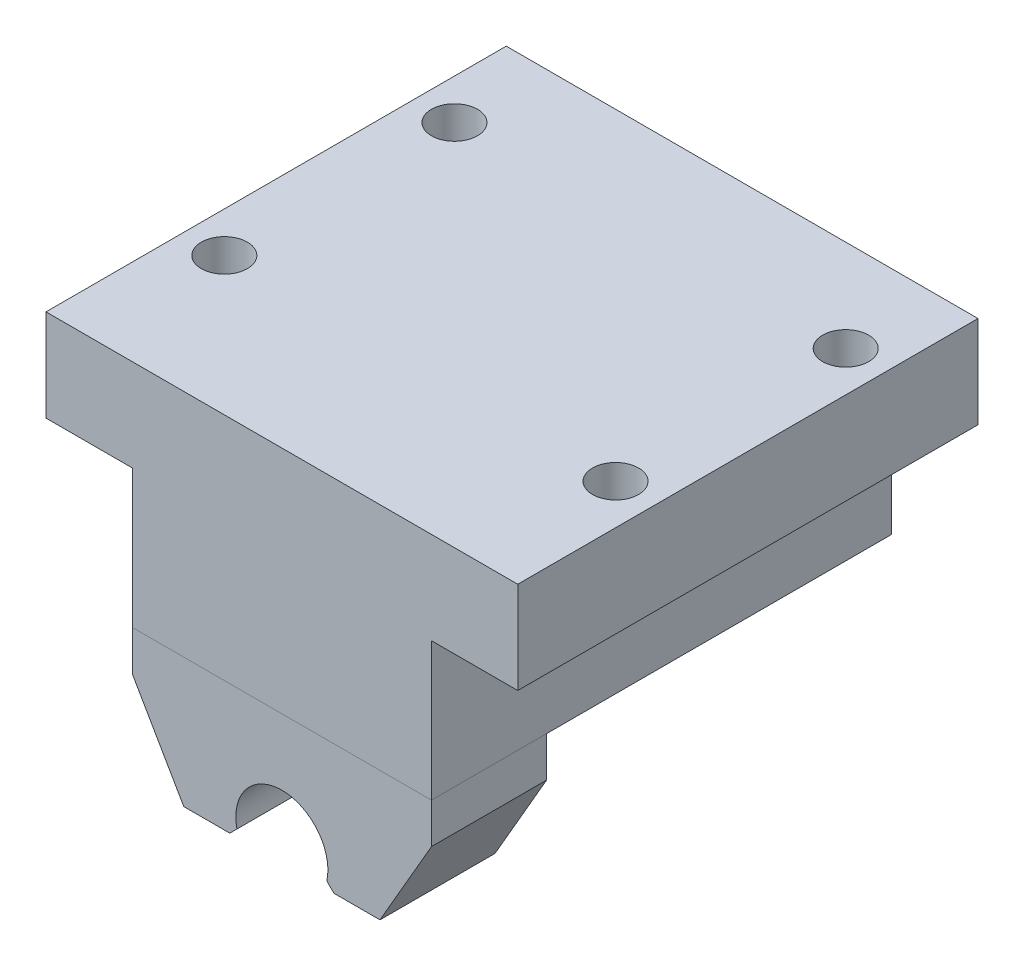
ISO-10303-21;
HEADER;
FILE_DESCRIPTION(('STEP AP214'),'2;1');
FILE_NAME('part.step','',(''),(''),'','','');
FILE_SCHEMA(('AUTOMOTIVE_DESIGN { 1 0 10303 214 1 1 1 1 }'));
ENDSEC;
DATA;
#1=APPLICATION_CONTEXT('core data for automotive mechanical design processes');
#2=APPLICATION_PROTOCOL_DEFINITION('international standard','automotive_design',2000,#1);
#3=PRODUCT_CONTEXT('',#1,'mechanical');
#4=PRODUCT('Part','Part','',(#3));
#5=PRODUCT_RELATED_PRODUCT_CATEGORY('part','',(#4));
#6=PRODUCT_DEFINITION_FORMATION('','',#4);
#7=PRODUCT_DEFINITION_CONTEXT('part definition',#1,'design');
#8=PRODUCT_DEFINITION('design','',#6,#7);
#9=PRODUCT_DEFINITION_SHAPE('','',#8);
#10=(LENGTH_UNIT() NAMED_UNIT(*) SI_UNIT(.MILLI.,.METRE.));
#11=(NAMED_UNIT(*) PLANE_ANGLE_UNIT() SI_UNIT($,.RADIAN.));
#12=(NAMED_UNIT(*) SI_UNIT($,.STERADIAN.) SOLID_ANGLE_UNIT());
#13=UNCERTAINTY_MEASURE_WITH_UNIT(LENGTH_MEASURE(1.E-05),#10,'distance_accuracy_value','');
#14=(GEOMETRIC_REPRESENTATION_CONTEXT(3) GLOBAL_UNCERTAINTY_ASSIGNED_CONTEXT((#13)) GLOBAL_UNIT_ASSIGNED_CONTEXT((#10,
#11,#12)) REPRESENTATION_CONTEXT('',''));
#15=CARTESIAN_POINT('',(0.,0.,0.));
#16=DIRECTION('',(0.,0.,1.));
#17=DIRECTION('',(1.,0.,0.));
#18=AXIS2_PLACEMENT_3D('',#15,#16,#17);
#19=CARTESIAN_POINT('',(13.,-16.,10.));
#20=DIRECTION('',(1.,0.,0.));
#21=DIRECTION('',(0.,0.,-1.));
#22=AXIS2_PLACEMENT_3D('',#19,#20,#21);
#23=PLANE('',#22);
#24=DIRECTION('',(0.,1.,0.));
#25=VECTOR('',#24,1.);
#26=CARTESIAN_POINT('',(13.,-16.,20.));
#27=LINE('',#26,#25);
#28=CARTESIAN_POINT('',(13.,-19.5,20.));
#29=VERTEX_POINT('',#28);
#30=CARTESIAN_POINT('',(13.,-16.,20.));
#31=VERTEX_POINT('',#30);
#32=EDGE_CURVE('E152',#29,#31,#27,.T.);
#33=ORIENTED_EDGE('',*,*,#32,.F.);
#34=DIRECTION('',(0.,0.,1.));
#35=VECTOR('',#34,1.);
#36=CARTESIAN_POINT('',(13.,-19.5,10.));
#37=LINE('',#36,#35);
#38=CARTESIAN_POINT('',(13.,-19.5,10.));
#39=VERTEX_POINT('',#38);
#40=EDGE_CURVE('E12',#39,#29,#37,.T.);
#41=ORIENTED_EDGE('',*,*,#40,.F.);
#42=DIRECTION('',(0.,1.,0.));
#43=VECTOR('',#42,1.);
#44=CARTESIAN_POINT('',(13.,-16.,10.));
#45=LINE('',#44,#43);
#46=CARTESIAN_POINT('',(13.,-16.,10.));
#47=VERTEX_POINT('',#46);
#48=EDGE_CURVE('E178',#39,#47,#45,.T.);
#49=ORIENTED_EDGE('',*,*,#48,.T.);
#50=DIRECTION('',(0.,0.,1.));
#51=VECTOR('',#50,1.);
#52=CARTESIAN_POINT('',(13.,-16.,10.));
#53=LINE('',#52,#51);
#54=EDGE_CURVE('E46',#47,#31,#53,.T.);
#55=ORIENTED_EDGE('',*,*,#54,.T.);
#56=EDGE_LOOP('',(#33,#41,#49,#55));
#57=FACE_BOUND('',#56,.T.);
#58=ADVANCED_FACE('F43',(#57),#23,.T.);
#59=CARTESIAN_POINT('',(13.,-19.5,10.));
#60=DIRECTION('',(0.866025403784438,-0.500000000000001,0.));
#61=DIRECTION('',(0.500000000000001,0.866025403784438,0.));
#62=AXIS2_PLACEMENT_3D('',#59,#60,#61);
#63=PLANE('',#62);
#64=DIRECTION('',(0.500000000000001,0.866025403784438,0.));
#65=VECTOR('',#64,1.);
#66=CARTESIAN_POINT('',(13.,-19.5,20.));
#67=LINE('',#66,#65);
#68=CARTESIAN_POINT('',(8.52553541378038,-27.25,20.));
#69=VERTEX_POINT('',#68);
#70=EDGE_CURVE('E176',#69,#29,#67,.T.);
#71=ORIENTED_EDGE('',*,*,#70,.F.);
#72=DIRECTION('',(0.,0.,1.));
#73=VECTOR('',#72,1.);
#74=CARTESIAN_POINT('',(8.52553541378038,-27.25,10.));
#75=LINE('',#74,#73);
#76=CARTESIAN_POINT('',(8.52553541378038,-27.25,10.));
#77=VERTEX_POINT('',#76);
#78=EDGE_CURVE('E52',#77,#69,#75,.T.);
#79=ORIENTED_EDGE('',*,*,#78,.F.);
#80=DIRECTION('',(0.500000000000001,0.866025403784438,0.));
#81=VECTOR('',#80,1.);
#82=CARTESIAN_POINT('',(13.,-19.5,10.));
#83=LINE('',#82,#81);
#84=EDGE_CURVE('E142',#77,#39,#83,.T.);
#85=ORIENTED_EDGE('',*,*,#84,.T.);
#86=ORIENTED_EDGE('',*,*,#40,.T.);
#87=EDGE_LOOP('',(#71,#79,#85,#86));
#88=FACE_BOUND('',#87,.T.);
#89=ADVANCED_FACE('F194',(#88),#63,.T.);
#90=CARTESIAN_POINT('',(8.52553541378038,-27.25,10.));
#91=DIRECTION('',(0.,-1.,0.));
#92=DIRECTION('',(0.,0.,-1.));
#93=AXIS2_PLACEMENT_3D('',#90,#91,#92);
#94=PLANE('',#93);
#95=DIRECTION('',(1.,0.,0.));
#96=VECTOR('',#95,1.);
#97=CARTESIAN_POINT('',(8.52553541378038,-27.25,20.));
#98=LINE('',#97,#96);
#99=CARTESIAN_POINT('',(4.52553541378038,-27.25,20.));
#100=VERTEX_POINT('',#99);
#101=EDGE_CURVE('E129',#100,#69,#98,.T.);
#102=ORIENTED_EDGE('',*,*,#101,.F.);
#103=DIRECTION('',(0.,0.,1.));
#104=VECTOR('',#103,1.);
#105=CARTESIAN_POINT('',(4.52553541378038,-27.25,10.));
#106=LINE('',#105,#104);
#107=CARTESIAN_POINT('',(4.52553541378038,-27.25,10.));
#108=VERTEX_POINT('',#107);
#109=EDGE_CURVE('E124',#108,#100,#106,.T.);
#110=ORIENTED_EDGE('',*,*,#109,.F.);
#111=DIRECTION('',(1.,0.,0.));
#112=VECTOR('',#111,1.);
#113=CARTESIAN_POINT('',(8.52553541378038,-27.25,10.));
#114=LINE('',#113,#112);
#115=EDGE_CURVE('E127',#108,#77,#114,.T.);
#116=ORIENTED_EDGE('',*,*,#115,.T.);
#117=ORIENTED_EDGE('',*,*,#78,.T.);
#118=EDGE_LOOP('',(#102,#110,#116,#117));
#119=FACE_BOUND('',#118,.T.);
#120=ADVANCED_FACE('F126',(#119),#94,.T.);
#121=CARTESIAN_POINT('',(4.52553541378038,-27.25,10.));
#122=DIRECTION('',(-0.707106781186548,-0.707106781186547,0.));
#123=DIRECTION('',(0.707106781186547,-0.707106781186548,0.));
#124=AXIS2_PLACEMENT_3D('',#121,#122,#123);
#125=PLANE('',#124);
#126=DIRECTION('',(0.707106781186547,-0.707106781186548,0.));
#127=VECTOR('',#126,1.);
#128=CARTESIAN_POINT('',(4.52553541378038,-27.25,20.));
#129=LINE('',#128,#127);
#130=CARTESIAN_POINT('',(3.90264926566882,-26.6271138518884,20.));
#131=VERTEX_POINT('',#130);
#132=EDGE_CURVE('E173',#131,#100,#129,.T.);
#133=ORIENTED_EDGE('',*,*,#132,.F.);
#134=DIRECTION('',(0.,0.,1.));
#135=VECTOR('',#134,1.);
#136=CARTESIAN_POINT('',(3.90264926566882,-26.6271138518884,10.));
#137=LINE('',#136,#135);
#138=CARTESIAN_POINT('',(3.90264926566882,-26.6271138518884,10.));
#139=VERTEX_POINT('',#138);
#140=EDGE_CURVE('E134',#139,#131,#137,.T.);
#141=ORIENTED_EDGE('',*,*,#140,.F.);
#142=DIRECTION('',(0.707106781186547,-0.707106781186548,0.));
#143=VECTOR('',#142,1.);
#144=CARTESIAN_POINT('',(4.52553541378038,-27.25,10.));
#145=LINE('',#144,#143);
#146=EDGE_CURVE('E140',#139,#108,#145,.T.);
#147=ORIENTED_EDGE('',*,*,#146,.T.);
#148=ORIENTED_EDGE('',*,*,#109,.T.);
#149=EDGE_LOOP('',(#133,#141,#147,#148));
#150=FACE_BOUND('',#149,.T.);
#151=ADVANCED_FACE('F144',(#150),#125,.T.);
#152=CARTESIAN_POINT('',(0.,-25.75,10.));
#153=DIRECTION('',(0.,0.,1.));
#154=DIRECTION('',(1.,0.,0.));
#155=AXIS2_PLACEMENT_3D('',#152,#153,#154);
#156=CYLINDRICAL_SURFACE('',#155,4.);
#157=CARTESIAN_POINT('',(0.,-25.75,20.));
#158=DIRECTION('',(0.,0.,-1.));
#159=DIRECTION('',(1.,0.,0.));
#160=AXIS2_PLACEMENT_3D('',#157,#158,#159);
#161=CIRCLE('',#160,4.);
#162=CARTESIAN_POINT('',(-3.90264926566883,-26.6271138518884,20.));
#163=VERTEX_POINT('',#162);
#164=EDGE_CURVE('E170',#163,#131,#161,.T.);
#165=ORIENTED_EDGE('',*,*,#164,.F.);
#166=DIRECTION('',(0.,0.,1.));
#167=VECTOR('',#166,1.);
#168=CARTESIAN_POINT('',(-3.90264926566883,-26.6271138518884,10.));
#169=LINE('',#168,#167);
#170=CARTESIAN_POINT('',(-3.90264926566883,-26.6271138518884,10.));
#171=VERTEX_POINT('',#170);
#172=EDGE_CURVE('E182',#171,#163,#169,.T.);
#173=ORIENTED_EDGE('',*,*,#172,.F.);
#174=CARTESIAN_POINT('',(0.,-25.75,10.));
#175=DIRECTION('',(0.,0.,-1.));
#176=DIRECTION('',(1.,0.,0.));
#177=AXIS2_PLACEMENT_3D('',#174,#175,#176);
#178=CIRCLE('',#177,4.);
#179=EDGE_CURVE('E145',#171,#139,#178,.T.);
#180=ORIENTED_EDGE('',*,*,#179,.T.);
#181=ORIENTED_EDGE('',*,*,#140,.T.);
#182=EDGE_LOOP('',(#165,#173,#180,#181));
#183=FACE_BOUND('',#182,.T.);
#184=ADVANCED_FACE('F207',(#183),#156,.F.);
#185=CARTESIAN_POINT('',(-4.52553541378039,-27.25,10.));
#186=DIRECTION('',(0.707106781186553,-0.707106781186542,0.));
#187=DIRECTION('',(0.707106781186542,0.707106781186553,0.));
#188=AXIS2_PLACEMENT_3D('',#185,#186,#187);
#189=PLANE('',#188);
#190=DIRECTION('',(0.707106781186542,0.707106781186553,0.));
#191=VECTOR('',#190,1.);
#192=CARTESIAN_POINT('',(-4.52553541378039,-27.25,20.));
#193=LINE('',#192,#191);
#194=CARTESIAN_POINT('',(-4.52553541378039,-27.25,20.));
#195=VERTEX_POINT('',#194);
#196=EDGE_CURVE('E167',#195,#163,#193,.T.);
#197=ORIENTED_EDGE('',*,*,#196,.F.);
#198=DIRECTION('',(0.,0.,1.));
#199=VECTOR('',#198,1.);
#200=CARTESIAN_POINT('',(-4.52553541378039,-27.25,10.));
#201=LINE('',#200,#199);
#202=CARTESIAN_POINT('',(-4.52553541378039,-27.25,10.));
#203=VERTEX_POINT('',#202);
#204=EDGE_CURVE('E184',#203,#195,#201,.T.);
#205=ORIENTED_EDGE('',*,*,#204,.F.);
#206=DIRECTION('',(0.707106781186542,0.707106781186553,0.));
#207=VECTOR('',#206,1.);
#208=CARTESIAN_POINT('',(-4.52553541378039,-27.25,10.));
#209=LINE('',#208,#207);
#210=EDGE_CURVE('E147',#203,#171,#209,.T.);
#211=ORIENTED_EDGE('',*,*,#210,.T.);
#212=ORIENTED_EDGE('',*,*,#172,.T.);
#213=EDGE_LOOP('',(#197,#205,#211,#212));
#214=FACE_BOUND('',#213,.T.);
#215=ADVANCED_FACE('F210',(#214),#189,.T.);
#216=CARTESIAN_POINT('',(-8.52553541378039,-27.25,10.));
#217=DIRECTION('',(0.,-1.,0.));
#218=DIRECTION('',(1.,0.,0.));
#219=AXIS2_PLACEMENT_3D('',#216,#217,#218);
#220=PLANE('',#219);
#221=DIRECTION('',(1.,0.,0.));
#222=VECTOR('',#221,1.);
#223=CARTESIAN_POINT('',(-8.52553541378039,-27.25,20.));
#224=LINE('',#223,#222);
#225=CARTESIAN_POINT('',(-8.52553541378039,-27.25,20.));
#226=VERTEX_POINT('',#225);
#227=EDGE_CURVE('E164',#226,#195,#224,.T.);
#228=ORIENTED_EDGE('',*,*,#227,.F.);
#229=DIRECTION('',(0.,0.,1.));
#230=VECTOR('',#229,1.);
#231=CARTESIAN_POINT('',(-8.52553541378039,-27.25,10.));
#232=LINE('',#231,#230);
#233=CARTESIAN_POINT('',(-8.52553541378039,-27.25,10.));
#234=VERTEX_POINT('',#233);
#235=EDGE_CURVE('E186',#234,#226,#232,.T.);
#236=ORIENTED_EDGE('',*,*,#235,.F.);
#237=DIRECTION('',(1.,0.,0.));
#238=VECTOR('',#237,1.);
#239=CARTESIAN_POINT('',(-8.52553541378039,-27.25,10.));
#240=LINE('',#239,#238);
#241=EDGE_CURVE('E309',#234,#203,#240,.T.);
#242=ORIENTED_EDGE('',*,*,#241,.T.);
#243=ORIENTED_EDGE('',*,*,#204,.T.);
#244=EDGE_LOOP('',(#228,#236,#242,#243));
#245=FACE_BOUND('',#244,.T.);
#246=ADVANCED_FACE('F214',(#245),#220,.T.);
#247=CARTESIAN_POINT('',(-13.,-19.5,10.));
#248=DIRECTION('',(-0.866025403784438,-0.500000000000001,0.));
#249=DIRECTION('',(0.500000000000001,-0.866025403784438,0.));
#250=AXIS2_PLACEMENT_3D('',#247,#248,#249);
#251=PLANE('',#250);
#252=DIRECTION('',(0.500000000000001,-0.866025403784438,0.));
#253=VECTOR('',#252,1.);
#254=CARTESIAN_POINT('',(-13.,-19.5,20.));
#255=LINE('',#254,#253);
#256=CARTESIAN_POINT('',(-13.,-19.5,20.));
#257=VERTEX_POINT('',#256);
#258=EDGE_CURVE('E161',#257,#226,#255,.T.);
#259=ORIENTED_EDGE('',*,*,#258,.F.);
#260=DIRECTION('',(0.,0.,1.));
#261=VECTOR('',#260,1.);
#262=CARTESIAN_POINT('',(-13.,-19.5,10.));
#263=LINE('',#262,#261);
#264=CARTESIAN_POINT('',(-13.,-19.5,10.));
#265=VERTEX_POINT('',#264);
#266=EDGE_CURVE('E188',#265,#257,#263,.T.);
#267=ORIENTED_EDGE('',*,*,#266,.F.);
#268=DIRECTION('',(0.500000000000001,-0.866025403784438,0.));
#269=VECTOR('',#268,1.);
#270=CARTESIAN_POINT('',(-13.,-19.5,10.));
#271=LINE('',#270,#269);
#272=EDGE_CURVE('E305',#265,#234,#271,.T.);
#273=ORIENTED_EDGE('',*,*,#272,.T.);
#274=ORIENTED_EDGE('',*,*,#235,.T.);
#275=EDGE_LOOP('',(#259,#267,#273,#274));
#276=FACE_BOUND('',#275,.T.);
#277=ADVANCED_FACE('F218',(#276),#251,.T.);
#278=CARTESIAN_POINT('',(-13.,-16.,10.));
#279=DIRECTION('',(-1.,0.,0.));
#280=DIRECTION('',(0.,0.,1.));
#281=AXIS2_PLACEMENT_3D('',#278,#279,#280);
#282=PLANE('',#281);
#283=DIRECTION('',(0.,-1.,0.));
#284=VECTOR('',#283,1.);
#285=CARTESIAN_POINT('',(-13.,-16.,20.));
#286=LINE('',#285,#284);
#287=CARTESIAN_POINT('',(-13.,-16.,20.));
#288=VERTEX_POINT('',#287);
#289=EDGE_CURVE('E158',#288,#257,#286,.T.);
#290=ORIENTED_EDGE('',*,*,#289,.F.);
#291=DIRECTION('',(0.,0.,1.));
#292=VECTOR('',#291,1.);
#293=CARTESIAN_POINT('',(-13.,-16.,10.));
#294=LINE('',#293,#292);
#295=CARTESIAN_POINT('',(-13.,-16.,10.));
#296=VERTEX_POINT('',#295);
#297=EDGE_CURVE('E189',#296,#288,#294,.T.);
#298=ORIENTED_EDGE('',*,*,#297,.F.);
#299=DIRECTION('',(0.,-1.,0.));
#300=VECTOR('',#299,1.);
#301=CARTESIAN_POINT('',(-13.,-16.,10.));
#302=LINE('',#301,#300);
#303=EDGE_CURVE('E316',#296,#265,#302,.T.);
#304=ORIENTED_EDGE('',*,*,#303,.T.);
#305=ORIENTED_EDGE('',*,*,#266,.T.);
#306=EDGE_LOOP('',(#290,#298,#304,#305));
#307=FACE_BOUND('',#306,.T.);
#308=ADVANCED_FACE('F222',(#307),#282,.T.);
#309=CARTESIAN_POINT('',(13.,-16.,10.));
#310=DIRECTION('',(0.,1.,0.));
#311=DIRECTION('',(0.,0.,1.));
#312=AXIS2_PLACEMENT_3D('',#309,#310,#311);
#313=PLANE('',#312);
#314=DIRECTION('',(-1.,0.,0.));
#315=VECTOR('',#314,1.);
#316=CARTESIAN_POINT('',(13.,-16.,20.));
#317=LINE('',#316,#315);
#318=EDGE_CURVE('E155',#31,#288,#317,.T.);
#319=ORIENTED_EDGE('',*,*,#318,.F.);
#320=ORIENTED_EDGE('',*,*,#54,.F.);
#321=DIRECTION('',(-1.,0.,0.));
#322=VECTOR('',#321,1.);
#323=CARTESIAN_POINT('',(13.,-16.,10.));
#324=LINE('',#323,#322);
#325=EDGE_CURVE('E318',#47,#296,#324,.T.);
#326=ORIENTED_EDGE('',*,*,#325,.T.);
#327=ORIENTED_EDGE('',*,*,#297,.T.);
#328=EDGE_LOOP('',(#319,#320,#326,#327));
#329=FACE_BOUND('',#328,.T.);
#330=ADVANCED_FACE('F191',(#329),#313,.T.);
#331=CARTESIAN_POINT('',(0.,-25.75,10.));
#332=DIRECTION('',(0.,0.,1.));
#333=DIRECTION('',(1.,0.,0.));
#334=AXIS2_PLACEMENT_3D('',#331,#332,#333);
#335=PLANE('',#334);
#336=ORIENTED_EDGE('',*,*,#48,.F.);
#337=ORIENTED_EDGE('',*,*,#84,.F.);
#338=ORIENTED_EDGE('',*,*,#115,.F.);
#339=ORIENTED_EDGE('',*,*,#146,.F.);
#340=ORIENTED_EDGE('',*,*,#179,.F.);
#341=ORIENTED_EDGE('',*,*,#210,.F.);
#342=ORIENTED_EDGE('',*,*,#241,.F.);
#343=ORIENTED_EDGE('',*,*,#272,.F.);
#344=ORIENTED_EDGE('',*,*,#303,.F.);
#345=ORIENTED_EDGE('',*,*,#325,.F.);
#346=EDGE_LOOP('',(#336,#337,#338,#339,#340,#341,#342,#343,#344,#345));
#347=FACE_BOUND('',#346,.T.);
#348=ADVANCED_FACE('F138',(#347),#335,.F.);
#349=CARTESIAN_POINT('',(0.,-25.75,20.));
#350=DIRECTION('',(0.,0.,1.));
#351=DIRECTION('',(1.,0.,0.));
#352=AXIS2_PLACEMENT_3D('',#349,#350,#351);
#353=PLANE('',#352);
#354=ORIENTED_EDGE('',*,*,#32,.T.);
#355=ORIENTED_EDGE('',*,*,#318,.T.);
#356=ORIENTED_EDGE('',*,*,#289,.T.);
#357=ORIENTED_EDGE('',*,*,#258,.T.);
#358=ORIENTED_EDGE('',*,*,#227,.T.);
#359=ORIENTED_EDGE('',*,*,#196,.T.);
#360=ORIENTED_EDGE('',*,*,#164,.T.);
#361=ORIENTED_EDGE('',*,*,#132,.T.);
#362=ORIENTED_EDGE('',*,*,#101,.T.);
#363=ORIENTED_EDGE('',*,*,#70,.T.);
#364=EDGE_LOOP('',(#354,#355,#356,#357,#358,#359,#360,#361,#362,#363));
#365=FACE_BOUND('',#364,.T.);
#366=ADVANCED_FACE('F193',(#365),#353,.T.);
#367=CLOSED_SHELL('',(#58,#89,#120,#151,#184,#215,#246,#277,#308,#330,#348,#366));
#368=MANIFOLD_SOLID_BREP('B2',#367);
#369=CARTESIAN_POINT('',(20.5,-4.,20.));
#370=DIRECTION('',(-1.,0.,0.));
#371=DIRECTION('',(0.,0.,1.));
#372=AXIS2_PLACEMENT_3D('',#369,#370,#371);
#373=PLANE('',#372);
#374=DIRECTION('',(0.,1.,0.));
#375=VECTOR('',#374,1.);
#376=CARTESIAN_POINT('',(20.5,-4.,-20.));
#377=LINE('',#376,#375);
#378=CARTESIAN_POINT('',(20.5,-4.,-20.));
#379=VERTEX_POINT('',#378);
#380=CARTESIAN_POINT('',(20.5,4.,-20.));
#381=VERTEX_POINT('',#380);
#382=EDGE_CURVE('E419',#379,#381,#377,.T.);
#383=ORIENTED_EDGE('',*,*,#382,.T.);
#384=DIRECTION('',(0.,0.,-1.));
#385=VECTOR('',#384,1.);
#386=CARTESIAN_POINT('',(20.5,4.,20.));
#387=LINE('',#386,#385);
#388=CARTESIAN_POINT('',(20.5,4.,20.));
#389=VERTEX_POINT('',#388);
#390=EDGE_CURVE('E41',#389,#381,#387,.T.);
#391=ORIENTED_EDGE('',*,*,#390,.F.);
#392=DIRECTION('',(0.,1.,0.));
#393=VECTOR('',#392,1.);
#394=CARTESIAN_POINT('',(20.5,-4.,20.));
#395=LINE('',#394,#393);
#396=CARTESIAN_POINT('',(20.5,-4.,20.));
#397=VERTEX_POINT('',#396);
#398=EDGE_CURVE('E434',#397,#389,#395,.T.);
#399=ORIENTED_EDGE('',*,*,#398,.F.);
#400=DIRECTION('',(0.,0.,-1.));
#401=VECTOR('',#400,1.);
#402=CARTESIAN_POINT('',(20.5,-4.,20.));
#403=LINE('',#402,#401);
#404=EDGE_CURVE('E415',#397,#379,#403,.T.);
#405=ORIENTED_EDGE('',*,*,#404,.T.);
#406=EDGE_LOOP('',(#383,#391,#399,#405));
#407=FACE_BOUND('',#406,.T.);
#408=ADVANCED_FACE('F323',(#407),#373,.F.);
#409=CARTESIAN_POINT('',(-20.5,4.,20.));
#410=DIRECTION('',(0.,-1.,0.));
#411=DIRECTION('',(0.,0.,-1.));
#412=AXIS2_PLACEMENT_3D('',#409,#410,#411);
#413=PLANE('',#412);
#414=CARTESIAN_POINT('',(-17.,4.,8.));
#415=DIRECTION('',(0.,-1.,0.));
#416=DIRECTION('',(0.,0.,-1.));
#417=AXIS2_PLACEMENT_3D('',#414,#415,#416);
#418=CIRCLE('',#417,2.);
#419=CARTESIAN_POINT('',(-17.,4.,6.));
#420=VERTEX_POINT('',#419);
#421=EDGE_CURVE('E423',#420,#420,#418,.T.);
#422=ORIENTED_EDGE('',*,*,#421,.T.);
#423=EDGE_LOOP('',(#422));
#424=FACE_BOUND('',#423,.T.);
#425=CARTESIAN_POINT('',(17.,4.,-12.));
#426=DIRECTION('',(0.,-1.,0.));
#427=DIRECTION('',(0.,0.,-1.));
#428=AXIS2_PLACEMENT_3D('',#425,#426,#427);
#429=CIRCLE('',#428,2.00000000000001);
#430=CARTESIAN_POINT('',(17.,4.,-14.));
#431=VERTEX_POINT('',#430);
#432=EDGE_CURVE('E472',#431,#431,#429,.T.);
#433=ORIENTED_EDGE('',*,*,#432,.T.);
#434=EDGE_LOOP('',(#433));
#435=FACE_BOUND('',#434,.T.);
#436=CARTESIAN_POINT('',(17.,4.,8.));
#437=DIRECTION('',(0.,-1.,0.));
#438=DIRECTION('',(0.,0.,-1.));
#439=AXIS2_PLACEMENT_3D('',#436,#437,#438);
#440=CIRCLE('',#439,2.);
#441=CARTESIAN_POINT('',(17.,4.,6.));
#442=VERTEX_POINT('',#441);
#443=EDGE_CURVE('E475',#442,#442,#440,.T.);
#444=ORIENTED_EDGE('',*,*,#443,.T.);
#445=EDGE_LOOP('',(#444));
#446=FACE_BOUND('',#445,.T.);
#447=CARTESIAN_POINT('',(-17.,4.,-12.));
#448=DIRECTION('',(0.,-1.,0.));
#449=DIRECTION('',(0.,0.,-1.));
#450=AXIS2_PLACEMENT_3D('',#447,#448,#449);
#451=CIRCLE('',#450,2.);
#452=CARTESIAN_POINT('',(-17.,4.,-14.));
#453=VERTEX_POINT('',#452);
#454=EDGE_CURVE('E469',#453,#453,#451,.T.);
#455=ORIENTED_EDGE('',*,*,#454,.T.);
#456=EDGE_LOOP('',(#455));
#457=FACE_BOUND('',#456,.T.);
#458=DIRECTION('',(-1.,0.,0.));
#459=VECTOR('',#458,1.);
#460=CARTESIAN_POINT('',(-20.5,4.,-20.));
#461=LINE('',#460,#459);
#462=CARTESIAN_POINT('',(-20.5,4.,-20.));
#463=VERTEX_POINT('',#462);
#464=EDGE_CURVE('E422',#381,#463,#461,.T.);
#465=ORIENTED_EDGE('',*,*,#464,.T.);
#466=DIRECTION('',(0.,0.,-1.));
#467=VECTOR('',#466,1.);
#468=CARTESIAN_POINT('',(-20.5,4.,20.));
#469=LINE('',#468,#467);
#470=CARTESIAN_POINT('',(-20.5,4.,20.));
#471=VERTEX_POINT('',#470);
#472=EDGE_CURVE('E331',#471,#463,#469,.T.);
#473=ORIENTED_EDGE('',*,*,#472,.F.);
#474=DIRECTION('',(-1.,0.,0.));
#475=VECTOR('',#474,1.);
#476=CARTESIAN_POINT('',(-20.5,4.,20.));
#477=LINE('',#476,#475);
#478=EDGE_CURVE('E382',#389,#471,#477,.T.);
#479=ORIENTED_EDGE('',*,*,#478,.F.);
#480=ORIENTED_EDGE('',*,*,#390,.T.);
#481=EDGE_LOOP('',(#465,#473,#479,#480));
#482=FACE_BOUND('',#481,.T.);
#483=ADVANCED_FACE('F516',(#424,#435,#446,#457,#482),#413,.F.);
#484=CARTESIAN_POINT('',(-20.5,-4.,20.));
#485=DIRECTION('',(1.,0.,0.));
#486=DIRECTION('',(0.,0.,-1.));
#487=AXIS2_PLACEMENT_3D('',#484,#485,#486);
#488=PLANE('',#487);
#489=DIRECTION('',(0.,-1.,0.));
#490=VECTOR('',#489,1.);
#491=CARTESIAN_POINT('',(-20.5,-4.,-20.));
#492=LINE('',#491,#490);
#493=CARTESIAN_POINT('',(-20.5,-4.,-20.));
#494=VERTEX_POINT('',#493);
#495=EDGE_CURVE('E425',#463,#494,#492,.T.);
#496=ORIENTED_EDGE('',*,*,#495,.T.);
#497=DIRECTION('',(0.,0.,-1.));
#498=VECTOR('',#497,1.);
#499=CARTESIAN_POINT('',(-20.5,-4.,20.));
#500=LINE('',#499,#498);
#501=CARTESIAN_POINT('',(-20.5,-4.,20.));
#502=VERTEX_POINT('',#501);
#503=EDGE_CURVE('E441',#502,#494,#500,.T.);
#504=ORIENTED_EDGE('',*,*,#503,.F.);
#505=DIRECTION('',(0.,-1.,0.));
#506=VECTOR('',#505,1.);
#507=CARTESIAN_POINT('',(-20.5,-4.,20.));
#508=LINE('',#507,#506);
#509=EDGE_CURVE('E449',#471,#502,#508,.T.);
#510=ORIENTED_EDGE('',*,*,#509,.F.);
#511=ORIENTED_EDGE('',*,*,#472,.T.);
#512=EDGE_LOOP('',(#496,#504,#510,#511));
#513=FACE_BOUND('',#512,.T.);
#514=ADVANCED_FACE('F447',(#513),#488,.F.);
#515=CARTESIAN_POINT('',(-20.5,-4.,20.));
#516=DIRECTION('',(0.,1.,0.));
#517=DIRECTION('',(0.,0.,1.));
#518=AXIS2_PLACEMENT_3D('',#515,#516,#517);
#519=PLANE('',#518);
#520=CARTESIAN_POINT('',(-17.,-4.,8.));
#521=DIRECTION('',(0.,-1.,0.));
#522=DIRECTION('',(0.,0.,-1.));
#523=AXIS2_PLACEMENT_3D('',#520,#521,#522);
#524=CIRCLE('',#523,2.);
#525=CARTESIAN_POINT('',(-17.,-4.,6.));
#526=VERTEX_POINT('',#525);
#527=EDGE_CURVE('E481',#526,#526,#524,.T.);
#528=ORIENTED_EDGE('',*,*,#527,.F.);
#529=EDGE_LOOP('',(#528));
#530=FACE_BOUND('',#529,.T.);
#531=CARTESIAN_POINT('',(-17.,-4.,-12.));
#532=DIRECTION('',(0.,-1.,0.));
#533=DIRECTION('',(0.,0.,-1.));
#534=AXIS2_PLACEMENT_3D('',#531,#532,#533);
#535=CIRCLE('',#534,2.);
#536=CARTESIAN_POINT('',(-17.,-4.,-14.));
#537=VERTEX_POINT('',#536);
#538=EDGE_CURVE('E478',#537,#537,#535,.T.);
#539=ORIENTED_EDGE('',*,*,#538,.F.);
#540=EDGE_LOOP('',(#539));
#541=FACE_BOUND('',#540,.T.);
#542=DIRECTION('',(1.,0.,0.));
#543=VECTOR('',#542,1.);
#544=CARTESIAN_POINT('',(-20.5,-4.,-20.));
#545=LINE('',#544,#543);
#546=CARTESIAN_POINT('',(-13.,-4.,-20.));
#547=VERTEX_POINT('',#546);
#548=EDGE_CURVE('E427',#494,#547,#545,.T.);
#549=ORIENTED_EDGE('',*,*,#548,.T.);
#550=DIRECTION('',(0.,0.,-1.));
#551=VECTOR('',#550,1.);
#552=CARTESIAN_POINT('',(-13.,-4.,20.));
#553=LINE('',#552,#551);
#554=CARTESIAN_POINT('',(-13.,-4.,20.));
#555=VERTEX_POINT('',#554);
#556=EDGE_CURVE('E438',#555,#547,#553,.T.);
#557=ORIENTED_EDGE('',*,*,#556,.F.);
#558=DIRECTION('',(1.,0.,0.));
#559=VECTOR('',#558,1.);
#560=CARTESIAN_POINT('',(-20.5,-4.,20.));
#561=LINE('',#560,#559);
#562=EDGE_CURVE('E461',#502,#555,#561,.T.);
#563=ORIENTED_EDGE('',*,*,#562,.F.);
#564=ORIENTED_EDGE('',*,*,#503,.T.);
#565=EDGE_LOOP('',(#549,#557,#563,#564));
#566=FACE_BOUND('',#565,.T.);
#567=ADVANCED_FACE('F457',(#530,#541,#566),#519,.F.);
#568=CARTESIAN_POINT('',(-13.,-4.,20.));
#569=DIRECTION('',(1.,0.,0.));
#570=DIRECTION('',(0.,1.,0.));
#571=AXIS2_PLACEMENT_3D('',#568,#569,#570);
#572=PLANE('',#571);
#573=DIRECTION('',(0.,-1.,0.));
#574=VECTOR('',#573,1.);
#575=CARTESIAN_POINT('',(-13.,-4.,-20.));
#576=LINE('',#575,#574);
#577=CARTESIAN_POINT('',(-13.,-16.,-20.));
#578=VERTEX_POINT('',#577);
#579=EDGE_CURVE('E429',#547,#578,#576,.T.);
#580=ORIENTED_EDGE('',*,*,#579,.T.);
#581=DIRECTION('',(0.,0.,-1.));
#582=VECTOR('',#581,1.);
#583=CARTESIAN_POINT('',(-13.,-16.,20.));
#584=LINE('',#583,#582);
#585=CARTESIAN_POINT('',(-13.,-16.,20.));
#586=VERTEX_POINT('',#585);
#587=EDGE_CURVE('E410',#586,#578,#584,.T.);
#588=ORIENTED_EDGE('',*,*,#587,.F.);
#589=DIRECTION('',(0.,-1.,0.));
#590=VECTOR('',#589,1.);
#591=CARTESIAN_POINT('',(-13.,-4.,20.));
#592=LINE('',#591,#590);
#593=EDGE_CURVE('E401',#555,#586,#592,.T.);
#594=ORIENTED_EDGE('',*,*,#593,.F.);
#595=ORIENTED_EDGE('',*,*,#556,.T.);
#596=EDGE_LOOP('',(#580,#588,#594,#595));
#597=FACE_BOUND('',#596,.T.);
#598=ADVANCED_FACE('F460',(#597),#572,.F.);
#599=CARTESIAN_POINT('',(-13.,-16.,20.));
#600=DIRECTION('',(0.,1.,0.));
#601=DIRECTION('',(0.,0.,1.));
#602=AXIS2_PLACEMENT_3D('',#599,#600,#601);
#603=PLANE('',#602);
#604=CARTESIAN_POINT('',(0.,-16.,-4.5));
#605=DIRECTION('',(0.,-1.,0.));
#606=DIRECTION('',(0.,0.,-1.));
#607=AXIS2_PLACEMENT_3D('',#604,#605,#606);
#608=CIRCLE('',#607,5.075);
#609=CARTESIAN_POINT('',(0.,-16.,-9.575));
#610=VERTEX_POINT('',#609);
#611=EDGE_CURVE('E491',#610,#610,#608,.T.);
#612=ORIENTED_EDGE('',*,*,#611,.F.);
#613=EDGE_LOOP('',(#612));
#614=FACE_BOUND('',#613,.T.);
#615=DIRECTION('',(1.,0.,0.));
#616=VECTOR('',#615,1.);
#617=CARTESIAN_POINT('',(-13.,-16.,-20.));
#618=LINE('',#617,#616);
#619=CARTESIAN_POINT('',(13.,-16.,-20.));
#620=VERTEX_POINT('',#619);
#621=EDGE_CURVE('E409',#578,#620,#618,.T.);
#622=ORIENTED_EDGE('',*,*,#621,.T.);
#623=DIRECTION('',(0.,0.,-1.));
#624=VECTOR('',#623,1.);
#625=CARTESIAN_POINT('',(13.,-16.,20.));
#626=LINE('',#625,#624);
#627=CARTESIAN_POINT('',(13.,-16.,20.));
#628=VERTEX_POINT('',#627);
#629=EDGE_CURVE('E406',#628,#620,#626,.T.);
#630=ORIENTED_EDGE('',*,*,#629,.F.);
#631=DIRECTION('',(1.,0.,0.));
#632=VECTOR('',#631,1.);
#633=CARTESIAN_POINT('',(-13.,-16.,20.));
#634=LINE('',#633,#632);
#635=EDGE_CURVE('E395',#586,#628,#634,.T.);
#636=ORIENTED_EDGE('',*,*,#635,.F.);
#637=ORIENTED_EDGE('',*,*,#587,.T.);
#638=EDGE_LOOP('',(#622,#630,#636,#637));
#639=FACE_BOUND('',#638,.T.);
#640=ADVANCED_FACE('F407',(#614,#639),#603,.F.);
#641=CARTESIAN_POINT('',(13.,-4.,20.));
#642=DIRECTION('',(-1.,0.,0.));
#643=DIRECTION('',(0.,-1.,0.));
#644=AXIS2_PLACEMENT_3D('',#641,#642,#643);
#645=PLANE('',#644);
#646=DIRECTION('',(0.,1.,0.));
#647=VECTOR('',#646,1.);
#648=CARTESIAN_POINT('',(13.,-4.,-20.));
#649=LINE('',#648,#647);
#650=CARTESIAN_POINT('',(13.,-4.,-20.));
#651=VERTEX_POINT('',#650);
#652=EDGE_CURVE('E368',#620,#651,#649,.T.);
#653=ORIENTED_EDGE('',*,*,#652,.T.);
#654=DIRECTION('',(0.,0.,-1.));
#655=VECTOR('',#654,1.);
#656=CARTESIAN_POINT('',(13.,-4.,20.));
#657=LINE('',#656,#655);
#658=CARTESIAN_POINT('',(13.,-4.,20.));
#659=VERTEX_POINT('',#658);
#660=EDGE_CURVE('E411',#659,#651,#657,.T.);
#661=ORIENTED_EDGE('',*,*,#660,.F.);
#662=DIRECTION('',(0.,1.,0.));
#663=VECTOR('',#662,1.);
#664=CARTESIAN_POINT('',(13.,-4.,20.));
#665=LINE('',#664,#663);
#666=EDGE_CURVE('E399',#628,#659,#665,.T.);
#667=ORIENTED_EDGE('',*,*,#666,.F.);
#668=ORIENTED_EDGE('',*,*,#629,.T.);
#669=EDGE_LOOP('',(#653,#661,#667,#668));
#670=FACE_BOUND('',#669,.T.);
#671=ADVANCED_FACE('F413',(#670),#645,.F.);
#672=CARTESIAN_POINT('',(13.,-4.,20.));
#673=DIRECTION('',(0.,1.,0.));
#674=DIRECTION('',(0.,0.,1.));
#675=AXIS2_PLACEMENT_3D('',#672,#673,#674);
#676=PLANE('',#675);
#677=CARTESIAN_POINT('',(17.,-4.,-12.));
#678=DIRECTION('',(0.,-1.,0.));
#679=DIRECTION('',(0.,0.,-1.));
#680=AXIS2_PLACEMENT_3D('',#677,#678,#679);
#681=CIRCLE('',#680,2.00000000000001);
#682=CARTESIAN_POINT('',(17.,-4.,-14.));
#683=VERTEX_POINT('',#682);
#684=EDGE_CURVE('E482',#683,#683,#681,.T.);
#685=ORIENTED_EDGE('',*,*,#684,.F.);
#686=EDGE_LOOP('',(#685));
#687=FACE_BOUND('',#686,.T.);
#688=CARTESIAN_POINT('',(17.,-4.,8.));
#689=DIRECTION('',(0.,-1.,0.));
#690=DIRECTION('',(0.,0.,-1.));
#691=AXIS2_PLACEMENT_3D('',#688,#689,#690);
#692=CIRCLE('',#691,2.);
#693=CARTESIAN_POINT('',(17.,-4.,6.));
#694=VERTEX_POINT('',#693);
#695=EDGE_CURVE('E485',#694,#694,#692,.T.);
#696=ORIENTED_EDGE('',*,*,#695,.F.);
#697=EDGE_LOOP('',(#696));
#698=FACE_BOUND('',#697,.T.);
#699=DIRECTION('',(1.,0.,0.));
#700=VECTOR('',#699,1.);
#701=CARTESIAN_POINT('',(13.,-4.,-20.));
#702=LINE('',#701,#700);
#703=EDGE_CURVE('E374',#651,#379,#702,.T.);
#704=ORIENTED_EDGE('',*,*,#703,.T.);
#705=ORIENTED_EDGE('',*,*,#404,.F.);
#706=DIRECTION('',(1.,0.,0.));
#707=VECTOR('',#706,1.);
#708=CARTESIAN_POINT('',(13.,-4.,20.));
#709=LINE('',#708,#707);
#710=EDGE_CURVE('E339',#659,#397,#709,.T.);
#711=ORIENTED_EDGE('',*,*,#710,.F.);
#712=ORIENTED_EDGE('',*,*,#660,.T.);
#713=EDGE_LOOP('',(#704,#705,#711,#712));
#714=FACE_BOUND('',#713,.T.);
#715=ADVANCED_FACE('F512',(#687,#698,#714),#676,.F.);
#716=CARTESIAN_POINT('',(0.,0.,20.));
#717=DIRECTION('',(0.,0.,-1.));
#718=DIRECTION('',(-1.,0.,0.));
#719=AXIS2_PLACEMENT_3D('',#716,#717,#718);
#720=PLANE('',#719);
#721=ORIENTED_EDGE('',*,*,#398,.T.);
#722=ORIENTED_EDGE('',*,*,#478,.T.);
#723=ORIENTED_EDGE('',*,*,#509,.T.);
#724=ORIENTED_EDGE('',*,*,#562,.T.);
#725=ORIENTED_EDGE('',*,*,#593,.T.);
#726=ORIENTED_EDGE('',*,*,#635,.T.);
#727=ORIENTED_EDGE('',*,*,#666,.T.);
#728=ORIENTED_EDGE('',*,*,#710,.T.);
#729=EDGE_LOOP('',(#721,#722,#723,#724,#725,#726,#727,#728));
#730=FACE_BOUND('',#729,.T.);
#731=ADVANCED_FACE('F397',(#730),#720,.F.);
#732=CARTESIAN_POINT('',(0.,0.,-20.));
#733=DIRECTION('',(0.,0.,-1.));
#734=DIRECTION('',(-1.,0.,0.));
#735=AXIS2_PLACEMENT_3D('',#732,#733,#734);
#736=PLANE('',#735);
#737=ORIENTED_EDGE('',*,*,#382,.F.);
#738=ORIENTED_EDGE('',*,*,#703,.F.);
#739=ORIENTED_EDGE('',*,*,#652,.F.);
#740=ORIENTED_EDGE('',*,*,#621,.F.);
#741=ORIENTED_EDGE('',*,*,#579,.F.);
#742=ORIENTED_EDGE('',*,*,#548,.F.);
#743=ORIENTED_EDGE('',*,*,#495,.F.);
#744=ORIENTED_EDGE('',*,*,#464,.F.);
#745=EDGE_LOOP('',(#737,#738,#739,#740,#741,#742,#743,#744));
#746=FACE_BOUND('',#745,.T.);
#747=ADVANCED_FACE('F453',(#746),#736,.T.);
#748=CARTESIAN_POINT('',(17.,6.,8.));
#749=DIRECTION('',(0.,-1.,0.));
#750=DIRECTION('',(0.,0.,-1.));
#751=AXIS2_PLACEMENT_3D('',#748,#749,#750);
#752=CYLINDRICAL_SURFACE('',#751,2.);
#753=ORIENTED_EDGE('',*,*,#695,.T.);
#754=EDGE_LOOP('',(#753));
#755=FACE_BOUND('',#754,.T.);
#756=ORIENTED_EDGE('',*,*,#443,.F.);
#757=EDGE_LOOP('',(#756));
#758=FACE_BOUND('',#757,.T.);
#759=ADVANCED_FACE('F535',(#755,#758),#752,.F.);
#760=CARTESIAN_POINT('',(17.,6.,-12.));
#761=DIRECTION('',(0.,-1.,0.));
#762=DIRECTION('',(0.,0.,-1.));
#763=AXIS2_PLACEMENT_3D('',#760,#761,#762);
#764=CYLINDRICAL_SURFACE('',#763,2.00000000000001);
#765=ORIENTED_EDGE('',*,*,#684,.T.);
#766=EDGE_LOOP('',(#765));
#767=FACE_BOUND('',#766,.T.);
#768=ORIENTED_EDGE('',*,*,#432,.F.);
#769=EDGE_LOOP('',(#768));
#770=FACE_BOUND('',#769,.T.);
#771=ADVANCED_FACE('F540',(#767,#770),#764,.F.);
#772=CARTESIAN_POINT('',(-17.,6.,-12.));
#773=DIRECTION('',(0.,-1.,0.));
#774=DIRECTION('',(0.,0.,-1.));
#775=AXIS2_PLACEMENT_3D('',#772,#773,#774);
#776=CYLINDRICAL_SURFACE('',#775,2.);
#777=ORIENTED_EDGE('',*,*,#538,.T.);
#778=EDGE_LOOP('',(#777));
#779=FACE_BOUND('',#778,.T.);
#780=ORIENTED_EDGE('',*,*,#454,.F.);
#781=EDGE_LOOP('',(#780));
#782=FACE_BOUND('',#781,.T.);
#783=ADVANCED_FACE('F537',(#779,#782),#776,.F.);
#784=CARTESIAN_POINT('',(-17.,6.,8.));
#785=DIRECTION('',(0.,-1.,0.));
#786=DIRECTION('',(0.,0.,-1.));
#787=AXIS2_PLACEMENT_3D('',#784,#785,#786);
#788=CYLINDRICAL_SURFACE('',#787,2.);
#789=ORIENTED_EDGE('',*,*,#527,.T.);
#790=EDGE_LOOP('',(#789));
#791=FACE_BOUND('',#790,.T.);
#792=ORIENTED_EDGE('',*,*,#421,.F.);
#793=EDGE_LOOP('',(#792));
#794=FACE_BOUND('',#793,.T.);
#795=ADVANCED_FACE('F502',(#791,#794),#788,.F.);
#796=CARTESIAN_POINT('',(0.,-14.5,-4.5));
#797=DIRECTION('',(0.,-1.,0.));
#798=DIRECTION('',(0.,0.,-1.));
#799=AXIS2_PLACEMENT_3D('',#796,#797,#798);
#800=CYLINDRICAL_SURFACE('',#799,5.075);
#801=CARTESIAN_POINT('',(0.,-14.5,-4.5));
#802=DIRECTION('',(0.,-1.,0.));
#803=DIRECTION('',(0.,0.,-1.));
#804=AXIS2_PLACEMENT_3D('',#801,#802,#803);
#805=CIRCLE('',#804,5.075);
#806=CARTESIAN_POINT('',(0.,-14.5,-9.575));
#807=VERTEX_POINT('',#806);
#808=EDGE_CURVE('E490',#807,#807,#805,.T.);
#809=ORIENTED_EDGE('',*,*,#808,.F.);
#810=EDGE_LOOP('',(#809));
#811=FACE_BOUND('',#810,.T.);
#812=ORIENTED_EDGE('',*,*,#611,.T.);
#813=EDGE_LOOP('',(#812));
#814=FACE_BOUND('',#813,.T.);
#815=ADVANCED_FACE('F499',(#811,#814),#800,.F.);
#816=CARTESIAN_POINT('',(0.,-14.5,-4.5));
#817=DIRECTION('',(0.,-1.,0.));
#818=DIRECTION('',(0.,0.,-1.));
#819=AXIS2_PLACEMENT_3D('',#816,#817,#818);
#820=PLANE('',#819);
#821=ORIENTED_EDGE('',*,*,#808,.T.);
#822=EDGE_LOOP('',(#821));
#823=FACE_BOUND('',#822,.T.);
#824=ADVANCED_FACE('F497',(#823),#820,.T.);
#825=CLOSED_SHELL('',(#408,#483,#514,#567,#598,#640,#671,#715,#731,#747,#759,#771,#783,#795,
#815,#824));
#826=MANIFOLD_SOLID_BREP('B6',#825);
#827=ADVANCED_BREP_SHAPE_REPRESENTATION('',(#18,#368,#826),#14);
#828=SHAPE_DEFINITION_REPRESENTATION(#9,#827);
ENDSEC;
END-ISO-10303-21;
